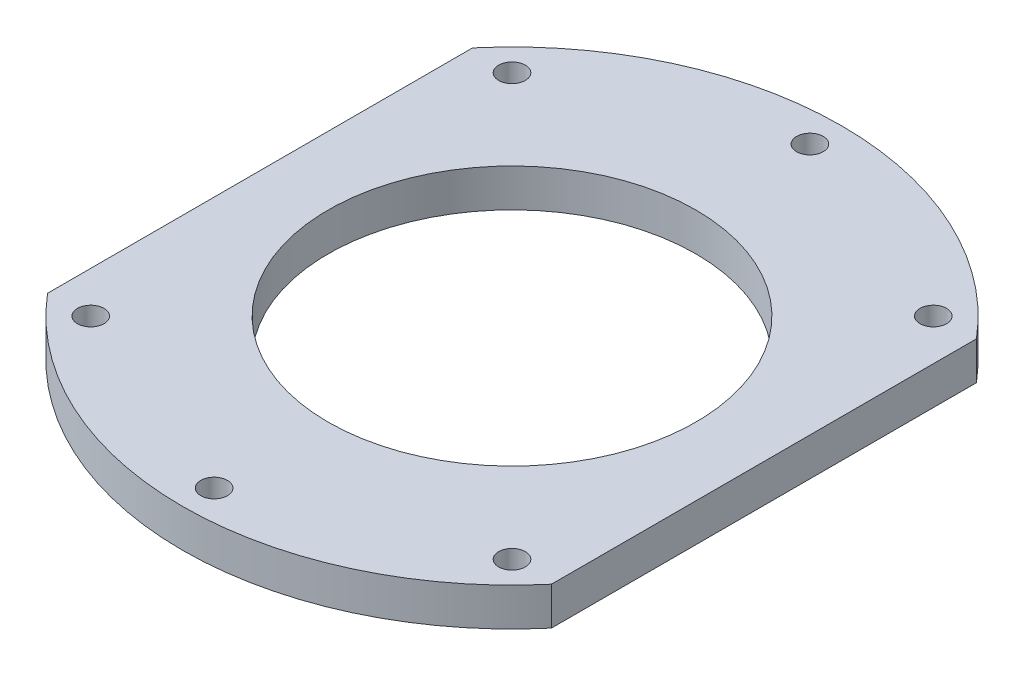
ISO-10303-21;
HEADER;
FILE_DESCRIPTION(('STEP AP214'),'2;1');
FILE_NAME('part.step','',(''),(''),'','','');
FILE_SCHEMA(('AUTOMOTIVE_DESIGN { 1 0 10303 214 1 1 1 1 }'));
ENDSEC;
DATA;
#1=APPLICATION_CONTEXT('core data for automotive mechanical design processes');
#2=APPLICATION_PROTOCOL_DEFINITION('international standard','automotive_design',2000,#1);
#3=PRODUCT_CONTEXT('',#1,'mechanical');
#4=PRODUCT('Part','Part','',(#3));
#5=PRODUCT_RELATED_PRODUCT_CATEGORY('part','',(#4));
#6=PRODUCT_DEFINITION_FORMATION('','',#4);
#7=PRODUCT_DEFINITION_CONTEXT('part definition',#1,'design');
#8=PRODUCT_DEFINITION('design','',#6,#7);
#9=PRODUCT_DEFINITION_SHAPE('','',#8);
#10=(LENGTH_UNIT() NAMED_UNIT(*) SI_UNIT(.MILLI.,.METRE.));
#11=(NAMED_UNIT(*) PLANE_ANGLE_UNIT() SI_UNIT($,.RADIAN.));
#12=(NAMED_UNIT(*) SI_UNIT($,.STERADIAN.) SOLID_ANGLE_UNIT());
#13=UNCERTAINTY_MEASURE_WITH_UNIT(LENGTH_MEASURE(1.E-05),#10,'distance_accuracy_value','');
#14=(GEOMETRIC_REPRESENTATION_CONTEXT(3) GLOBAL_UNCERTAINTY_ASSIGNED_CONTEXT((#13)) GLOBAL_UNIT_ASSIGNED_CONTEXT((#10,
#11,#12)) REPRESENTATION_CONTEXT('',''));
#15=CARTESIAN_POINT('',(0.,0.,0.));
#16=DIRECTION('',(0.,0.,1.));
#17=DIRECTION('',(1.,0.,0.));
#18=AXIS2_PLACEMENT_3D('',#15,#16,#17);
#19=CARTESIAN_POINT('',(0.,6.,0.));
#20=DIRECTION('',(0.,1.,0.));
#21=DIRECTION('',(0.,0.,1.));
#22=AXIS2_PLACEMENT_3D('',#19,#20,#21);
#23=PLANE('',#22);
#24=CARTESIAN_POINT('',(0.,6.,-47.));
#25=DIRECTION('',(0.,1.,0.));
#26=DIRECTION('',(0.,0.,1.));
#27=AXIS2_PLACEMENT_3D('',#24,#25,#26);
#28=CIRCLE('',#27,2.1);
#29=CARTESIAN_POINT('',(0.,6.,-44.9));
#30=VERTEX_POINT('',#29);
#31=EDGE_CURVE('E283',#30,#30,#28,.T.);
#32=ORIENTED_EDGE('',*,*,#31,.F.);
#33=EDGE_LOOP('',(#32));
#34=FACE_BOUND('',#33,.T.);
#35=CARTESIAN_POINT('',(0.,6.,47.));
#36=DIRECTION('',(0.,1.,0.));
#37=DIRECTION('',(0.,0.,1.));
#38=AXIS2_PLACEMENT_3D('',#35,#36,#37);
#39=CIRCLE('',#38,2.1);
#40=CARTESIAN_POINT('',(0.,6.,49.1));
#41=VERTEX_POINT('',#40);
#42=EDGE_CURVE('E307',#41,#41,#39,.T.);
#43=ORIENTED_EDGE('',*,*,#42,.F.);
#44=EDGE_LOOP('',(#43));
#45=FACE_BOUND('',#44,.T.);
#46=CARTESIAN_POINT('',(0.,6.,0.));
#47=DIRECTION('',(0.,1.,0.));
#48=DIRECTION('',(0.,0.,1.));
#49=AXIS2_PLACEMENT_3D('',#46,#47,#48);
#50=CIRCLE('',#49,29.);
#51=CARTESIAN_POINT('',(0.,6.,29.));
#52=VERTEX_POINT('',#51);
#53=EDGE_CURVE('E133',#52,#52,#50,.T.);
#54=ORIENTED_EDGE('',*,*,#53,.F.);
#55=EDGE_LOOP('',(#54));
#56=FACE_BOUND('',#55,.T.);
#57=CARTESIAN_POINT('',(33.2340187157677,6.,33.2340187157677));
#58=DIRECTION('',(0.,1.,0.));
#59=DIRECTION('',(0.,0.,1.));
#60=AXIS2_PLACEMENT_3D('',#57,#58,#59);
#61=CIRCLE('',#60,2.1);
#62=CARTESIAN_POINT('',(33.2340187157677,6.,35.3340187157677));
#63=VERTEX_POINT('',#62);
#64=EDGE_CURVE('E315',#63,#63,#61,.T.);
#65=ORIENTED_EDGE('',*,*,#64,.F.);
#66=EDGE_LOOP('',(#65));
#67=FACE_BOUND('',#66,.T.);
#68=CARTESIAN_POINT('',(-33.2340187157677,6.,33.2340187157677));
#69=DIRECTION('',(0.,1.,0.));
#70=DIRECTION('',(0.,0.,1.));
#71=AXIS2_PLACEMENT_3D('',#68,#69,#70);
#72=CIRCLE('',#71,2.1);
#73=CARTESIAN_POINT('',(-33.2340187157677,6.,35.3340187157677));
#74=VERTEX_POINT('',#73);
#75=EDGE_CURVE('E299',#74,#74,#72,.T.);
#76=ORIENTED_EDGE('',*,*,#75,.F.);
#77=EDGE_LOOP('',(#76));
#78=FACE_BOUND('',#77,.T.);
#79=CARTESIAN_POINT('',(-33.2340187157677,6.,-33.2340187157677));
#80=DIRECTION('',(0.,1.,0.));
#81=DIRECTION('',(0.,0.,1.));
#82=AXIS2_PLACEMENT_3D('',#79,#80,#81);
#83=CIRCLE('',#82,2.1);
#84=CARTESIAN_POINT('',(-33.2340187157677,6.,-31.1340187157677));
#85=VERTEX_POINT('',#84);
#86=EDGE_CURVE('E291',#85,#85,#83,.T.);
#87=ORIENTED_EDGE('',*,*,#86,.F.);
#88=EDGE_LOOP('',(#87));
#89=FACE_BOUND('',#88,.T.);
#90=CARTESIAN_POINT('',(33.2340187157677,6.,-33.2340187157677));
#91=DIRECTION('',(0.,1.,0.));
#92=DIRECTION('',(0.,0.,1.));
#93=AXIS2_PLACEMENT_3D('',#90,#91,#92);
#94=CIRCLE('',#93,2.1);
#95=CARTESIAN_POINT('',(33.2340187157677,6.,-31.1340187157677));
#96=VERTEX_POINT('',#95);
#97=EDGE_CURVE('E270',#96,#96,#94,.T.);
#98=ORIENTED_EDGE('',*,*,#97,.F.);
#99=EDGE_LOOP('',(#98));
#100=FACE_BOUND('',#99,.T.);
#101=CARTESIAN_POINT('',(0.,6.,0.));
#102=DIRECTION('',(0.,1.,0.));
#103=DIRECTION('',(0.,0.,1.));
#104=AXIS2_PLACEMENT_3D('',#101,#102,#103);
#105=CIRCLE('',#104,52.);
#106=CARTESIAN_POINT('',(-39.75,6.,33.525177106169));
#107=VERTEX_POINT('',#106);
#108=CARTESIAN_POINT('',(39.75,6.,33.525177106169));
#109=VERTEX_POINT('',#108);
#110=EDGE_CURVE('E115',#107,#109,#105,.T.);
#111=ORIENTED_EDGE('',*,*,#110,.T.);
#112=DIRECTION('',(0.,0.,-1.));
#113=VECTOR('',#112,1.);
#114=CARTESIAN_POINT('',(39.75,6.,55.0176136765046));
#115=LINE('',#114,#113);
#116=CARTESIAN_POINT('',(39.75,6.,-33.525177106169));
#117=VERTEX_POINT('',#116);
#118=EDGE_CURVE('E102',#109,#117,#115,.T.);
#119=ORIENTED_EDGE('',*,*,#118,.T.);
#120=CARTESIAN_POINT('',(-39.75,6.,-33.525177106169));
#121=VERTEX_POINT('',#120);
#122=EDGE_CURVE('E120',#117,#121,#105,.T.);
#123=ORIENTED_EDGE('',*,*,#122,.T.);
#124=DIRECTION('',(0.,0.,1.));
#125=VECTOR('',#124,1.);
#126=CARTESIAN_POINT('',(-39.75,6.,55.0176136765046));
#127=LINE('',#126,#125);
#128=EDGE_CURVE('E110',#121,#107,#127,.T.);
#129=ORIENTED_EDGE('',*,*,#128,.T.);
#130=EDGE_LOOP('',(#111,#119,#123,#129));
#131=FACE_BOUND('',#130,.T.);
#132=ADVANCED_FACE('F63',(#34,#45,#56,#67,#78,#89,#100,#131),#23,.T.);
#133=CARTESIAN_POINT('',(0.,0.,0.));
#134=DIRECTION('',(0.,1.,0.));
#135=DIRECTION('',(0.,0.,1.));
#136=AXIS2_PLACEMENT_3D('',#133,#134,#135);
#137=PLANE('',#136);
#138=CARTESIAN_POINT('',(0.,0.,0.));
#139=DIRECTION('',(0.,1.,0.));
#140=DIRECTION('',(0.,0.,1.));
#141=AXIS2_PLACEMENT_3D('',#138,#139,#140);
#142=CIRCLE('',#141,29.);
#143=CARTESIAN_POINT('',(0.,0.,29.));
#144=VERTEX_POINT('',#143);
#145=EDGE_CURVE('E129',#144,#144,#142,.T.);
#146=ORIENTED_EDGE('',*,*,#145,.T.);
#147=EDGE_LOOP('',(#146));
#148=FACE_BOUND('',#147,.T.);
#149=CARTESIAN_POINT('',(33.2340187157677,0.,33.2340187157677));
#150=DIRECTION('',(0.,1.,0.));
#151=DIRECTION('',(0.,0.,1.));
#152=AXIS2_PLACEMENT_3D('',#149,#150,#151);
#153=CIRCLE('',#152,2.1);
#154=CARTESIAN_POINT('',(33.2340187157677,0.,35.3340187157677));
#155=VERTEX_POINT('',#154);
#156=EDGE_CURVE('E311',#155,#155,#153,.T.);
#157=ORIENTED_EDGE('',*,*,#156,.T.);
#158=EDGE_LOOP('',(#157));
#159=FACE_BOUND('',#158,.T.);
#160=CARTESIAN_POINT('',(0.,0.,47.));
#161=DIRECTION('',(0.,1.,0.));
#162=DIRECTION('',(0.,0.,1.));
#163=AXIS2_PLACEMENT_3D('',#160,#161,#162);
#164=CIRCLE('',#163,2.1);
#165=CARTESIAN_POINT('',(0.,0.,49.1));
#166=VERTEX_POINT('',#165);
#167=EDGE_CURVE('E303',#166,#166,#164,.T.);
#168=ORIENTED_EDGE('',*,*,#167,.T.);
#169=EDGE_LOOP('',(#168));
#170=FACE_BOUND('',#169,.T.);
#171=CARTESIAN_POINT('',(-33.2340187157677,0.,33.2340187157677));
#172=DIRECTION('',(0.,1.,0.));
#173=DIRECTION('',(0.,0.,1.));
#174=AXIS2_PLACEMENT_3D('',#171,#172,#173);
#175=CIRCLE('',#174,2.1);
#176=CARTESIAN_POINT('',(-33.2340187157677,0.,35.3340187157677));
#177=VERTEX_POINT('',#176);
#178=EDGE_CURVE('E295',#177,#177,#175,.T.);
#179=ORIENTED_EDGE('',*,*,#178,.T.);
#180=EDGE_LOOP('',(#179));
#181=FACE_BOUND('',#180,.T.);
#182=CARTESIAN_POINT('',(-33.2340187157677,0.,-33.2340187157677));
#183=DIRECTION('',(0.,1.,0.));
#184=DIRECTION('',(0.,0.,1.));
#185=AXIS2_PLACEMENT_3D('',#182,#183,#184);
#186=CIRCLE('',#185,2.1);
#187=CARTESIAN_POINT('',(-33.2340187157677,0.,-31.1340187157677));
#188=VERTEX_POINT('',#187);
#189=EDGE_CURVE('E287',#188,#188,#186,.T.);
#190=ORIENTED_EDGE('',*,*,#189,.T.);
#191=EDGE_LOOP('',(#190));
#192=FACE_BOUND('',#191,.T.);
#193=CARTESIAN_POINT('',(0.,0.,-47.));
#194=DIRECTION('',(0.,1.,0.));
#195=DIRECTION('',(0.,0.,1.));
#196=AXIS2_PLACEMENT_3D('',#193,#194,#195);
#197=CIRCLE('',#196,2.1);
#198=CARTESIAN_POINT('',(0.,0.,-44.9));
#199=VERTEX_POINT('',#198);
#200=EDGE_CURVE('E279',#199,#199,#197,.T.);
#201=ORIENTED_EDGE('',*,*,#200,.T.);
#202=EDGE_LOOP('',(#201));
#203=FACE_BOUND('',#202,.T.);
#204=CARTESIAN_POINT('',(33.2340187157677,0.,-33.2340187157677));
#205=DIRECTION('',(0.,1.,0.));
#206=DIRECTION('',(0.,0.,1.));
#207=AXIS2_PLACEMENT_3D('',#204,#205,#206);
#208=CIRCLE('',#207,2.1);
#209=CARTESIAN_POINT('',(33.2340187157677,0.,-31.1340187157677));
#210=VERTEX_POINT('',#209);
#211=EDGE_CURVE('E273',#210,#210,#208,.T.);
#212=ORIENTED_EDGE('',*,*,#211,.T.);
#213=EDGE_LOOP('',(#212));
#214=FACE_BOUND('',#213,.T.);
#215=DIRECTION('',(0.,0.,-1.));
#216=VECTOR('',#215,1.);
#217=CARTESIAN_POINT('',(39.75,0.,0.));
#218=LINE('',#217,#216);
#219=CARTESIAN_POINT('',(39.75,0.,33.525177106169));
#220=VERTEX_POINT('',#219);
#221=CARTESIAN_POINT('',(39.75,0.,-33.525177106169));
#222=VERTEX_POINT('',#221);
#223=EDGE_CURVE('E86',#220,#222,#218,.T.);
#224=ORIENTED_EDGE('',*,*,#223,.F.);
#225=CARTESIAN_POINT('',(0.,0.,0.));
#226=DIRECTION('',(0.,1.,0.));
#227=DIRECTION('',(0.,0.,1.));
#228=AXIS2_PLACEMENT_3D('',#225,#226,#227);
#229=CIRCLE('',#228,52.);
#230=CARTESIAN_POINT('',(-39.75,0.,33.525177106169));
#231=VERTEX_POINT('',#230);
#232=EDGE_CURVE('E117',#231,#220,#229,.T.);
#233=ORIENTED_EDGE('',*,*,#232,.F.);
#234=DIRECTION('',(0.,0.,1.));
#235=VECTOR('',#234,1.);
#236=CARTESIAN_POINT('',(-39.75,0.,0.));
#237=LINE('',#236,#235);
#238=CARTESIAN_POINT('',(-39.75,0.,-33.525177106169));
#239=VERTEX_POINT('',#238);
#240=EDGE_CURVE('E79',#239,#231,#237,.T.);
#241=ORIENTED_EDGE('',*,*,#240,.F.);
#242=EDGE_CURVE('E121',#222,#239,#229,.T.);
#243=ORIENTED_EDGE('',*,*,#242,.F.);
#244=EDGE_LOOP('',(#224,#233,#241,#243));
#245=FACE_BOUND('',#244,.T.);
#246=ADVANCED_FACE('F144',(#148,#159,#170,#181,#192,#203,#214,#245),#137,.F.);
#247=CARTESIAN_POINT('',(0.,6.,0.));
#248=DIRECTION('',(0.,-1.,0.));
#249=DIRECTION('',(0.,0.,-1.));
#250=AXIS2_PLACEMENT_3D('',#247,#248,#249);
#251=CYLINDRICAL_SURFACE('',#250,52.);
#252=DIRECTION('',(0.,-1.,0.));
#253=VECTOR('',#252,1.);
#254=CARTESIAN_POINT('',(39.75,6.,33.525177106169));
#255=LINE('',#254,#253);
#256=EDGE_CURVE('E12',#109,#220,#255,.T.);
#257=ORIENTED_EDGE('',*,*,#256,.F.);
#258=ORIENTED_EDGE('',*,*,#110,.F.);
#259=DIRECTION('',(0.,-1.,0.));
#260=VECTOR('',#259,1.);
#261=CARTESIAN_POINT('',(-39.75,6.,33.525177106169));
#262=LINE('',#261,#260);
#263=EDGE_CURVE('E125',#231,#107,#262,.F.);
#264=ORIENTED_EDGE('',*,*,#263,.F.);
#265=ORIENTED_EDGE('',*,*,#232,.T.);
#266=EDGE_LOOP('',(#257,#258,#264,#265));
#267=FACE_BOUND('',#266,.T.);
#268=ADVANCED_FACE('F65',(#267),#251,.T.);
#269=DIRECTION('',(0.,-1.,0.));
#270=VECTOR('',#269,1.);
#271=CARTESIAN_POINT('',(39.75,6.,-33.525177106169));
#272=LINE('',#271,#270);
#273=EDGE_CURVE('E72',#222,#117,#272,.F.);
#274=ORIENTED_EDGE('',*,*,#273,.F.);
#275=ORIENTED_EDGE('',*,*,#242,.T.);
#276=DIRECTION('',(0.,-1.,0.));
#277=VECTOR('',#276,1.);
#278=CARTESIAN_POINT('',(-39.75,6.,-33.525177106169));
#279=LINE('',#278,#277);
#280=EDGE_CURVE('E136',#121,#239,#279,.T.);
#281=ORIENTED_EDGE('',*,*,#280,.F.);
#282=ORIENTED_EDGE('',*,*,#122,.F.);
#283=EDGE_LOOP('',(#274,#275,#281,#282));
#284=FACE_BOUND('',#283,.T.);
#285=ADVANCED_FACE('F147',(#284),#251,.T.);
#286=CARTESIAN_POINT('',(0.,6.,0.));
#287=DIRECTION('',(0.,-1.,0.));
#288=DIRECTION('',(0.,0.,-1.));
#289=AXIS2_PLACEMENT_3D('',#286,#287,#288);
#290=CYLINDRICAL_SURFACE('',#289,29.);
#291=ORIENTED_EDGE('',*,*,#53,.T.);
#292=EDGE_LOOP('',(#291));
#293=FACE_BOUND('',#292,.T.);
#294=ORIENTED_EDGE('',*,*,#145,.F.);
#295=EDGE_LOOP('',(#294));
#296=FACE_BOUND('',#295,.T.);
#297=ADVANCED_FACE('F149',(#293,#296),#290,.F.);
#298=CARTESIAN_POINT('',(33.2340187157677,6.,33.2340187157677));
#299=DIRECTION('',(0.,-1.,0.));
#300=DIRECTION('',(0.,0.,-1.));
#301=AXIS2_PLACEMENT_3D('',#298,#299,#300);
#302=CYLINDRICAL_SURFACE('',#301,2.1);
#303=ORIENTED_EDGE('',*,*,#64,.T.);
#304=EDGE_LOOP('',(#303));
#305=FACE_BOUND('',#304,.T.);
#306=ORIENTED_EDGE('',*,*,#156,.F.);
#307=EDGE_LOOP('',(#306));
#308=FACE_BOUND('',#307,.T.);
#309=ADVANCED_FACE('F154',(#305,#308),#302,.F.);
#310=CARTESIAN_POINT('',(0.,6.,47.));
#311=DIRECTION('',(0.,-1.,0.));
#312=DIRECTION('',(0.,0.,-1.));
#313=AXIS2_PLACEMENT_3D('',#310,#311,#312);
#314=CYLINDRICAL_SURFACE('',#313,2.1);
#315=ORIENTED_EDGE('',*,*,#42,.T.);
#316=EDGE_LOOP('',(#315));
#317=FACE_BOUND('',#316,.T.);
#318=ORIENTED_EDGE('',*,*,#167,.F.);
#319=EDGE_LOOP('',(#318));
#320=FACE_BOUND('',#319,.T.);
#321=ADVANCED_FACE('F169',(#317,#320),#314,.F.);
#322=CARTESIAN_POINT('',(-33.2340187157677,6.,33.2340187157677));
#323=DIRECTION('',(0.,-1.,0.));
#324=DIRECTION('',(0.,0.,-1.));
#325=AXIS2_PLACEMENT_3D('',#322,#323,#324);
#326=CYLINDRICAL_SURFACE('',#325,2.1);
#327=ORIENTED_EDGE('',*,*,#75,.T.);
#328=EDGE_LOOP('',(#327));
#329=FACE_BOUND('',#328,.T.);
#330=ORIENTED_EDGE('',*,*,#178,.F.);
#331=EDGE_LOOP('',(#330));
#332=FACE_BOUND('',#331,.T.);
#333=ADVANCED_FACE('F173',(#329,#332),#326,.F.);
#334=CARTESIAN_POINT('',(-33.2340187157677,6.,-33.2340187157677));
#335=DIRECTION('',(0.,-1.,0.));
#336=DIRECTION('',(0.,0.,-1.));
#337=AXIS2_PLACEMENT_3D('',#334,#335,#336);
#338=CYLINDRICAL_SURFACE('',#337,2.1);
#339=ORIENTED_EDGE('',*,*,#86,.T.);
#340=EDGE_LOOP('',(#339));
#341=FACE_BOUND('',#340,.T.);
#342=ORIENTED_EDGE('',*,*,#189,.F.);
#343=EDGE_LOOP('',(#342));
#344=FACE_BOUND('',#343,.T.);
#345=ADVANCED_FACE('F177',(#341,#344),#338,.F.);
#346=CARTESIAN_POINT('',(0.,6.,-47.));
#347=DIRECTION('',(0.,-1.,0.));
#348=DIRECTION('',(0.,0.,-1.));
#349=AXIS2_PLACEMENT_3D('',#346,#347,#348);
#350=CYLINDRICAL_SURFACE('',#349,2.1);
#351=ORIENTED_EDGE('',*,*,#31,.T.);
#352=EDGE_LOOP('',(#351));
#353=FACE_BOUND('',#352,.T.);
#354=ORIENTED_EDGE('',*,*,#200,.F.);
#355=EDGE_LOOP('',(#354));
#356=FACE_BOUND('',#355,.T.);
#357=ADVANCED_FACE('F181',(#353,#356),#350,.F.);
#358=CARTESIAN_POINT('',(33.2340187157677,6.,-33.2340187157677));
#359=DIRECTION('',(0.,-1.,0.));
#360=DIRECTION('',(0.,0.,-1.));
#361=AXIS2_PLACEMENT_3D('',#358,#359,#360);
#362=CYLINDRICAL_SURFACE('',#361,2.1);
#363=ORIENTED_EDGE('',*,*,#97,.T.);
#364=EDGE_LOOP('',(#363));
#365=FACE_BOUND('',#364,.T.);
#366=ORIENTED_EDGE('',*,*,#211,.F.);
#367=EDGE_LOOP('',(#366));
#368=FACE_BOUND('',#367,.T.);
#369=ADVANCED_FACE('F185',(#365,#368),#362,.F.);
#370=CARTESIAN_POINT('',(-39.75,-4.,55.0176136765046));
#371=DIRECTION('',(-1.,0.,0.));
#372=DIRECTION('',(0.,0.,1.));
#373=AXIS2_PLACEMENT_3D('',#370,#371,#372);
#374=PLANE('',#373);
#375=ORIENTED_EDGE('',*,*,#280,.T.);
#376=ORIENTED_EDGE('',*,*,#240,.T.);
#377=ORIENTED_EDGE('',*,*,#263,.T.);
#378=ORIENTED_EDGE('',*,*,#128,.F.);
#379=EDGE_LOOP('',(#375,#376,#377,#378));
#380=FACE_BOUND('',#379,.T.);
#381=ADVANCED_FACE('F140',(#380),#374,.T.);
#382=CARTESIAN_POINT('',(39.75,-4.,55.0176136765046));
#383=DIRECTION('',(1.,0.,0.));
#384=DIRECTION('',(0.,0.,-1.));
#385=AXIS2_PLACEMENT_3D('',#382,#383,#384);
#386=PLANE('',#385);
#387=ORIENTED_EDGE('',*,*,#256,.T.);
#388=ORIENTED_EDGE('',*,*,#223,.T.);
#389=ORIENTED_EDGE('',*,*,#273,.T.);
#390=ORIENTED_EDGE('',*,*,#118,.F.);
#391=EDGE_LOOP('',(#387,#388,#389,#390));
#392=FACE_BOUND('',#391,.T.);
#393=ADVANCED_FACE('F104',(#392),#386,.T.);
#394=CLOSED_SHELL('',(#132,#246,#268,#285,#297,#309,#321,#333,#345,#357,#369,#381,#393));
#395=MANIFOLD_SOLID_BREP('B2',#394);
#396=ADVANCED_BREP_SHAPE_REPRESENTATION('',(#18,#395),#14);
#397=SHAPE_DEFINITION_REPRESENTATION(#9,#396);
ENDSEC;
END-ISO-10303-21;
